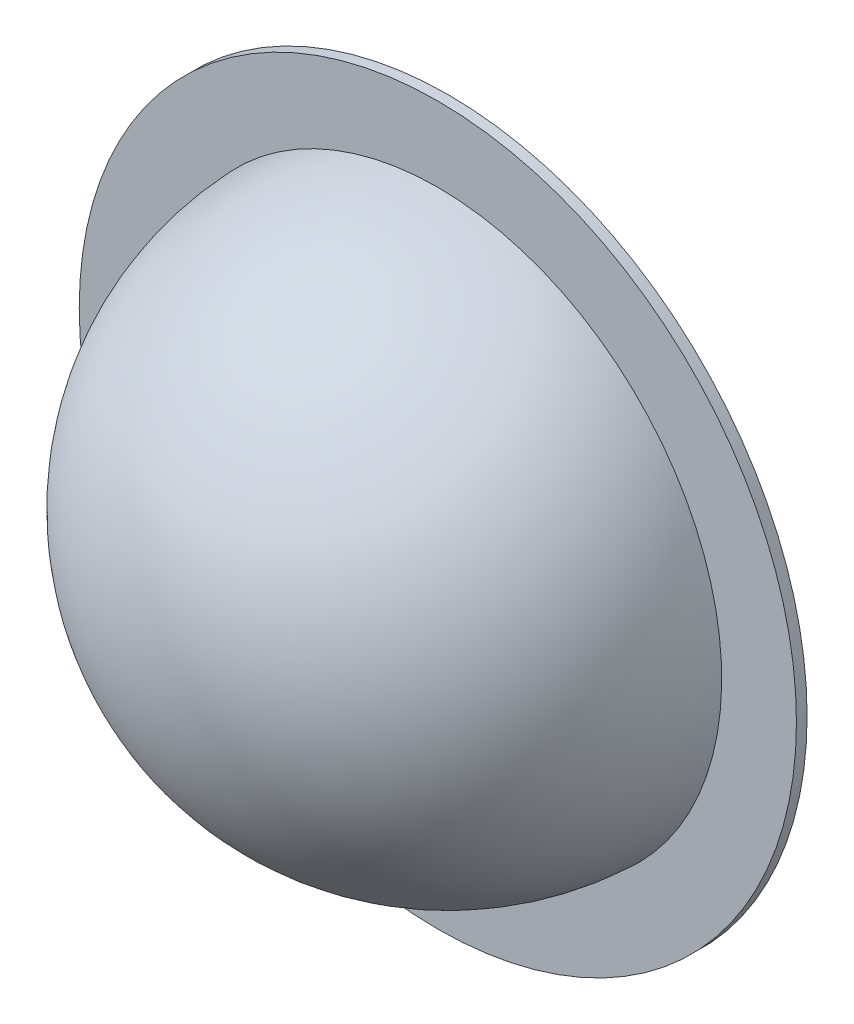
ISO-10303-21;
HEADER;
FILE_DESCRIPTION(('STEP AP214'),'2;1');
FILE_NAME('part.step','',(''),(''),'','','');
FILE_SCHEMA(('AUTOMOTIVE_DESIGN { 1 0 10303 214 1 1 1 1 }'));
ENDSEC;
DATA;
#1=APPLICATION_CONTEXT('core data for automotive mechanical design processes');
#2=APPLICATION_PROTOCOL_DEFINITION('international standard','automotive_design',2000,#1);
#3=PRODUCT_CONTEXT('',#1,'mechanical');
#4=PRODUCT('Part','Part','',(#3));
#5=PRODUCT_RELATED_PRODUCT_CATEGORY('part','',(#4));
#6=PRODUCT_DEFINITION_FORMATION('','',#4);
#7=PRODUCT_DEFINITION_CONTEXT('part definition',#1,'design');
#8=PRODUCT_DEFINITION('design','',#6,#7);
#9=PRODUCT_DEFINITION_SHAPE('','',#8);
#10=(LENGTH_UNIT() NAMED_UNIT(*) SI_UNIT(.MILLI.,.METRE.));
#11=(NAMED_UNIT(*) PLANE_ANGLE_UNIT() SI_UNIT($,.RADIAN.));
#12=(NAMED_UNIT(*) SI_UNIT($,.STERADIAN.) SOLID_ANGLE_UNIT());
#13=UNCERTAINTY_MEASURE_WITH_UNIT(LENGTH_MEASURE(1.E-05),#10,'distance_accuracy_value','');
#14=(GEOMETRIC_REPRESENTATION_CONTEXT(3) GLOBAL_UNCERTAINTY_ASSIGNED_CONTEXT((#13)) GLOBAL_UNIT_ASSIGNED_CONTEXT((#10,
#11,#12)) REPRESENTATION_CONTEXT('',''));
#15=CARTESIAN_POINT('',(0.,0.,0.));
#16=DIRECTION('',(0.,0.,1.));
#17=DIRECTION('',(1.,0.,0.));
#18=AXIS2_PLACEMENT_3D('',#15,#16,#17);
#19=CARTESIAN_POINT('',(-18.7622063786877,13.2376651058153,0.));
#20=DIRECTION('',(0.,0.,1.));
#21=DIRECTION('',(1.,0.,0.));
#22=AXIS2_PLACEMENT_3D('',#19,#20,#21);
#23=PLANE('',#22);
#24=CARTESIAN_POINT('',(0.,0.,0.));
#25=DIRECTION('',(0.,0.,-1.));
#26=DIRECTION('',(-1.,0.,0.));
#27=AXIS2_PLACEMENT_3D('',#24,#25,#26);
#28=CIRCLE('',#27,45.);
#29=CARTESIAN_POINT('',(-45.,0.,0.));
#30=VERTEX_POINT('',#29);
#31=EDGE_CURVE('E47',#30,#30,#28,.T.);
#32=ORIENTED_EDGE('',*,*,#31,.F.);
#33=EDGE_LOOP('',(#32));
#34=FACE_BOUND('',#33,.T.);
#35=CARTESIAN_POINT('',(0.,0.,0.));
#36=DIRECTION('',(0.,0.,1.));
#37=DIRECTION('',(1.,0.,0.));
#38=AXIS2_PLACEMENT_3D('',#35,#36,#37);
#39=CIRCLE('',#38,50.5);
#40=CARTESIAN_POINT('',(50.5,0.,0.));
#41=VERTEX_POINT('',#40);
#42=EDGE_CURVE('E61',#41,#41,#39,.T.);
#43=ORIENTED_EDGE('',*,*,#42,.F.);
#44=EDGE_LOOP('',(#43));
#45=FACE_BOUND('',#44,.T.);
#46=ADVANCED_FACE('F35',(#34,#45),#23,.F.);
#47=CARTESIAN_POINT('',(0.,0.,-24.6606940692324));
#48=DIRECTION('',(0.,0.,-1.));
#49=DIRECTION('',(-1.,0.,0.));
#50=AXIS2_PLACEMENT_3D('',#47,#48,#49);
#51=CYLINDRICAL_SURFACE('',#50,45.);
#52=ORIENTED_EDGE('',*,*,#31,.T.);
#53=EDGE_LOOP('',(#52));
#54=FACE_BOUND('',#53,.T.);
#55=CARTESIAN_POINT('',(0.,0.,-2.));
#56=DIRECTION('',(0.,0.,-1.));
#57=DIRECTION('',(-1.,0.,0.));
#58=AXIS2_PLACEMENT_3D('',#55,#56,#57);
#59=CIRCLE('',#58,45.);
#60=CARTESIAN_POINT('',(-45.,0.,-2.));
#61=VERTEX_POINT('',#60);
#62=EDGE_CURVE('E52',#61,#61,#59,.T.);
#63=ORIENTED_EDGE('',*,*,#62,.F.);
#64=EDGE_LOOP('',(#63));
#65=FACE_BOUND('',#64,.T.);
#66=ADVANCED_FACE('F81',(#54,#65),#51,.T.);
#67=CARTESIAN_POINT('',(-45.,0.,-2.));
#68=DIRECTION('',(0.,0.,-1.));
#69=DIRECTION('',(-1.,0.,0.));
#70=AXIS2_PLACEMENT_3D('',#67,#68,#69);
#71=PLANE('',#70);
#72=ORIENTED_EDGE('',*,*,#62,.T.);
#73=EDGE_LOOP('',(#72));
#74=FACE_BOUND('',#73,.T.);
#75=CARTESIAN_POINT('',(0.,0.,-2.));
#76=DIRECTION('',(0.,0.,-1.));
#77=DIRECTION('',(-1.,0.,0.));
#78=AXIS2_PLACEMENT_3D('',#75,#76,#77);
#79=CIRCLE('',#78,43.);
#80=CARTESIAN_POINT('',(-43.,0.,-2.));
#81=VERTEX_POINT('',#80);
#82=EDGE_CURVE('E55',#81,#81,#79,.T.);
#83=ORIENTED_EDGE('',*,*,#82,.F.);
#84=EDGE_LOOP('',(#83));
#85=FACE_BOUND('',#84,.T.);
#86=ADVANCED_FACE('F88',(#74,#85),#71,.T.);
#87=CARTESIAN_POINT('',(0.,0.,-24.6606940692324));
#88=DIRECTION('',(0.,0.,-1.));
#89=DIRECTION('',(-1.,0.,0.));
#90=AXIS2_PLACEMENT_3D('',#87,#88,#89);
#91=CYLINDRICAL_SURFACE('',#90,43.);
#92=ORIENTED_EDGE('',*,*,#82,.T.);
#93=EDGE_LOOP('',(#92));
#94=FACE_BOUND('',#93,.T.);
#95=CARTESIAN_POINT('',(0.,0.,0.));
#96=DIRECTION('',(0.,0.,-1.));
#97=DIRECTION('',(-1.,0.,0.));
#98=AXIS2_PLACEMENT_3D('',#95,#96,#97);
#99=CIRCLE('',#98,43.);
#100=CARTESIAN_POINT('',(-43.,0.,0.));
#101=VERTEX_POINT('',#100);
#102=EDGE_CURVE('E58',#101,#101,#99,.T.);
#103=ORIENTED_EDGE('',*,*,#102,.F.);
#104=EDGE_LOOP('',(#103));
#105=FACE_BOUND('',#104,.T.);
#106=ADVANCED_FACE('F99',(#94,#105),#91,.F.);
#107=CARTESIAN_POINT('',(0.,0.,0.));
#108=DIRECTION('',(0.,0.,-1.));
#109=DIRECTION('',(1.,0.,0.));
#110=AXIS2_PLACEMENT_3D('',#107,#108,#109);
#111=SPHERICAL_SURFACE('',#110,38.5);
#112=CARTESIAN_POINT('',(0.,0.,0.));
#113=DIRECTION('',(0.,0.,1.));
#114=DIRECTION('',(1.,0.,0.));
#115=AXIS2_PLACEMENT_3D('',#112,#113,#114);
#116=CIRCLE('',#115,38.5);
#117=CARTESIAN_POINT('',(38.5,0.,0.));
#118=VERTEX_POINT('',#117);
#119=EDGE_CURVE('E43',#118,#118,#116,.F.);
#120=ORIENTED_EDGE('',*,*,#119,.T.);
#121=EDGE_LOOP('',(#120));
#122=FACE_BOUND('',#121,.T.);
#123=ADVANCED_FACE('F93',(#122),#111,.F.);
#124=ORIENTED_EDGE('',*,*,#119,.F.);
#125=EDGE_LOOP('',(#124));
#126=FACE_BOUND('',#125,.T.);
#127=ORIENTED_EDGE('',*,*,#102,.T.);
#128=EDGE_LOOP('',(#127));
#129=FACE_BOUND('',#128,.T.);
#130=ADVANCED_FACE('F83',(#126,#129),#23,.F.);
#131=CARTESIAN_POINT('',(0.,0.,-2.));
#132=DIRECTION('',(0.,0.,1.));
#133=DIRECTION('',(1.,0.,0.));
#134=AXIS2_PLACEMENT_3D('',#131,#132,#133);
#135=CYLINDRICAL_SURFACE('',#134,50.5);
#136=CARTESIAN_POINT('',(0.,0.,1.5));
#137=DIRECTION('',(0.,0.,-1.));
#138=DIRECTION('',(-1.,0.,0.));
#139=AXIS2_PLACEMENT_3D('',#136,#137,#138);
#140=CIRCLE('',#139,50.5);
#141=CARTESIAN_POINT('',(-50.5,0.,1.5));
#142=VERTEX_POINT('',#141);
#143=EDGE_CURVE('E39',#142,#142,#140,.T.);
#144=ORIENTED_EDGE('',*,*,#143,.T.);
#145=EDGE_LOOP('',(#144));
#146=FACE_BOUND('',#145,.T.);
#147=ORIENTED_EDGE('',*,*,#42,.T.);
#148=EDGE_LOOP('',(#147));
#149=FACE_BOUND('',#148,.T.);
#150=ADVANCED_FACE('F68',(#146,#149),#135,.T.);
#151=CARTESIAN_POINT('',(0.,0.,0.));
#152=DIRECTION('',(0.,0.,1.));
#153=DIRECTION('',(0.,1.,0.));
#154=AXIS2_PLACEMENT_3D('',#151,#152,#153);
#155=SPHERICAL_SURFACE('',#154,40.);
#156=CARTESIAN_POINT('',(0.,0.,1.5));
#157=DIRECTION('',(0.,0.,-1.));
#158=DIRECTION('',(-1.,0.,0.));
#159=AXIS2_PLACEMENT_3D('',#156,#157,#158);
#160=CIRCLE('',#159,39.9718651053463);
#161=CARTESIAN_POINT('',(-39.9718651053463,0.,1.5));
#162=VERTEX_POINT('',#161);
#163=EDGE_CURVE('E11',#162,#162,#160,.T.);
#164=ORIENTED_EDGE('',*,*,#163,.F.);
#165=EDGE_LOOP('',(#164));
#166=FACE_BOUND('',#165,.T.);
#167=ADVANCED_FACE('F37',(#166),#155,.T.);
#168=CARTESIAN_POINT('',(0.,0.,1.5));
#169=DIRECTION('',(0.,0.,-1.));
#170=DIRECTION('',(-1.,0.,0.));
#171=AXIS2_PLACEMENT_3D('',#168,#169,#170);
#172=PLANE('',#171);
#173=ORIENTED_EDGE('',*,*,#163,.T.);
#174=EDGE_LOOP('',(#173));
#175=FACE_BOUND('',#174,.T.);
#176=ORIENTED_EDGE('',*,*,#143,.F.);
#177=EDGE_LOOP('',(#176));
#178=FACE_BOUND('',#177,.T.);
#179=ADVANCED_FACE('F70',(#175,#178),#172,.F.);
#180=CLOSED_SHELL('',(#46,#66,#86,#106,#123,#130,#150,#167,#179));
#181=MANIFOLD_SOLID_BREP('B2',#180);
#182=ADVANCED_BREP_SHAPE_REPRESENTATION('',(#18,#181),#14);
#183=SHAPE_DEFINITION_REPRESENTATION(#9,#182);
ENDSEC;
END-ISO-10303-21;
